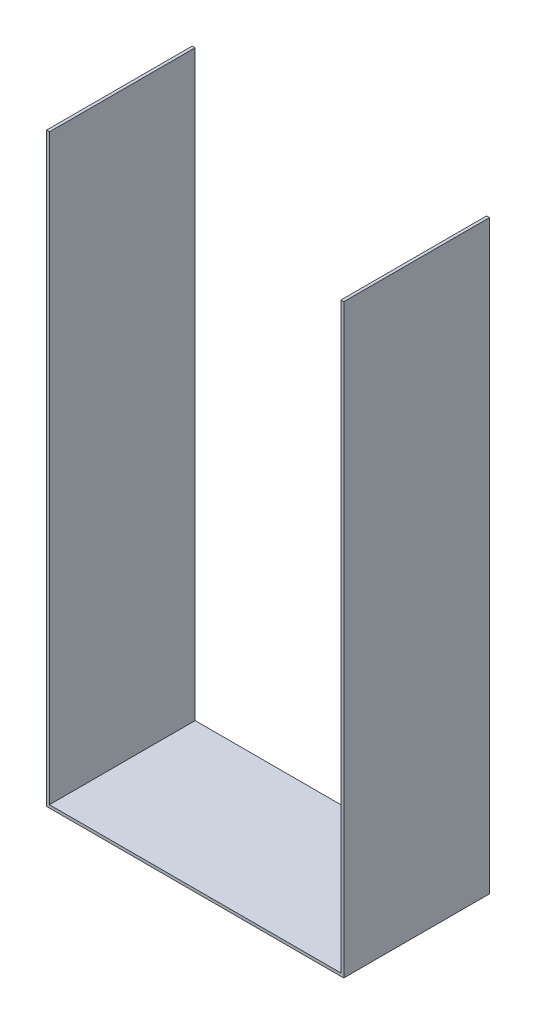
ISO-10303-21;
HEADER;
FILE_DESCRIPTION(('STEP AP214'),'2;1');
FILE_NAME('part.step','',(''),(''),'','','');
FILE_SCHEMA(('AUTOMOTIVE_DESIGN { 1 0 10303 214 1 1 1 1 }'));
ENDSEC;
DATA;
#1=APPLICATION_CONTEXT('core data for automotive mechanical design processes');
#2=APPLICATION_PROTOCOL_DEFINITION('international standard','automotive_design',2000,#1);
#3=PRODUCT_CONTEXT('',#1,'mechanical');
#4=PRODUCT('Part','Part','',(#3));
#5=PRODUCT_RELATED_PRODUCT_CATEGORY('part','',(#4));
#6=PRODUCT_DEFINITION_FORMATION('','',#4);
#7=PRODUCT_DEFINITION_CONTEXT('part definition',#1,'design');
#8=PRODUCT_DEFINITION('design','',#6,#7);
#9=PRODUCT_DEFINITION_SHAPE('','',#8);
#10=(LENGTH_UNIT() NAMED_UNIT(*) SI_UNIT(.MILLI.,.METRE.));
#11=(NAMED_UNIT(*) PLANE_ANGLE_UNIT() SI_UNIT($,.RADIAN.));
#12=(NAMED_UNIT(*) SI_UNIT($,.STERADIAN.) SOLID_ANGLE_UNIT());
#13=UNCERTAINTY_MEASURE_WITH_UNIT(LENGTH_MEASURE(1.E-05),#10,'distance_accuracy_value','');
#14=(GEOMETRIC_REPRESENTATION_CONTEXT(3) GLOBAL_UNCERTAINTY_ASSIGNED_CONTEXT((#13)) GLOBAL_UNIT_ASSIGNED_CONTEXT((#10,
#11,#12)) REPRESENTATION_CONTEXT('',''));
#15=CARTESIAN_POINT('',(0.,0.,0.));
#16=DIRECTION('',(0.,0.,1.));
#17=DIRECTION('',(1.,0.,0.));
#18=AXIS2_PLACEMENT_3D('',#15,#16,#17);
#19=CARTESIAN_POINT('',(-200.,0.,-10000.));
#20=DIRECTION('',(0.,1.,0.));
#21=DIRECTION('',(0.,0.,1.));
#22=AXIS2_PLACEMENT_3D('',#19,#20,#21);
#23=PLANE('',#22);
#24=DIRECTION('',(-1.,0.,0.));
#25=VECTOR('',#24,1.);
#26=CARTESIAN_POINT('',(-200.,0.,0.));
#27=LINE('',#26,#25);
#28=CARTESIAN_POINT('',(0.,0.,0.));
#29=VERTEX_POINT('',#28);
#30=CARTESIAN_POINT('',(-200.,0.,0.));
#31=VERTEX_POINT('',#30);
#32=EDGE_CURVE('E146',#29,#31,#27,.T.);
#33=ORIENTED_EDGE('',*,*,#32,.F.);
#34=DIRECTION('',(0.,0.,1.));
#35=VECTOR('',#34,1.);
#36=CARTESIAN_POINT('',(0.,0.,-10000.));
#37=LINE('',#36,#35);
#38=CARTESIAN_POINT('',(0.,0.,-10000.));
#39=VERTEX_POINT('',#38);
#40=EDGE_CURVE('E11',#39,#29,#37,.T.);
#41=ORIENTED_EDGE('',*,*,#40,.F.);
#42=DIRECTION('',(-1.,0.,0.));
#43=VECTOR('',#42,1.);
#44=CARTESIAN_POINT('',(-200.,0.,-10000.));
#45=LINE('',#44,#43);
#46=CARTESIAN_POINT('',(-200.,0.,-10000.));
#47=VERTEX_POINT('',#46);
#48=EDGE_CURVE('E174',#39,#47,#45,.T.);
#49=ORIENTED_EDGE('',*,*,#48,.T.);
#50=DIRECTION('',(0.,0.,1.));
#51=VECTOR('',#50,1.);
#52=CARTESIAN_POINT('',(-200.,0.,-10000.));
#53=LINE('',#52,#51);
#54=EDGE_CURVE('E46',#47,#31,#53,.T.);
#55=ORIENTED_EDGE('',*,*,#54,.T.);
#56=EDGE_LOOP('',(#33,#41,#49,#55));
#57=FACE_BOUND('',#56,.T.);
#58=ADVANCED_FACE('F43',(#57),#23,.T.);
#59=CARTESIAN_POINT('',(0.,0.,-10000.));
#60=DIRECTION('',(1.,0.,0.));
#61=DIRECTION('',(0.,1.,0.));
#62=AXIS2_PLACEMENT_3D('',#59,#60,#61);
#63=PLANE('',#62);
#64=DIRECTION('',(0.,1.,0.));
#65=VECTOR('',#64,1.);
#66=CARTESIAN_POINT('',(0.,0.,0.));
#67=LINE('',#66,#65);
#68=CARTESIAN_POINT('',(4.89858719658941E-12,-40000.,0.));
#69=VERTEX_POINT('',#68);
#70=EDGE_CURVE('E171',#69,#29,#67,.T.);
#71=ORIENTED_EDGE('',*,*,#70,.F.);
#72=DIRECTION('',(0.,0.,1.));
#73=VECTOR('',#72,1.);
#74=CARTESIAN_POINT('',(4.89858719658941E-12,-40000.,-10000.));
#75=LINE('',#74,#73);
#76=CARTESIAN_POINT('',(4.89858719658941E-12,-40000.,-10000.));
#77=VERTEX_POINT('',#76);
#78=EDGE_CURVE('E53',#77,#69,#75,.T.);
#79=ORIENTED_EDGE('',*,*,#78,.F.);
#80=DIRECTION('',(0.,1.,0.));
#81=VECTOR('',#80,1.);
#82=CARTESIAN_POINT('',(0.,0.,-10000.));
#83=LINE('',#82,#81);
#84=EDGE_CURVE('E132',#77,#39,#83,.T.);
#85=ORIENTED_EDGE('',*,*,#84,.T.);
#86=ORIENTED_EDGE('',*,*,#40,.T.);
#87=EDGE_LOOP('',(#71,#79,#85,#86));
#88=FACE_BOUND('',#87,.T.);
#89=ADVANCED_FACE('F192',(#88),#63,.T.);
#90=CARTESIAN_POINT('',(4.89858719658941E-12,-40000.,-10000.));
#91=DIRECTION('',(0.,1.,0.));
#92=DIRECTION('',(0.,0.,1.));
#93=AXIS2_PLACEMENT_3D('',#90,#91,#92);
#94=PLANE('',#93);
#95=DIRECTION('',(-1.,0.,0.));
#96=VECTOR('',#95,1.);
#97=CARTESIAN_POINT('',(4.89858719658941E-12,-40000.,0.));
#98=LINE('',#97,#96);
#99=CARTESIAN_POINT('',(20000.,-40000.,0.));
#100=VERTEX_POINT('',#99);
#101=EDGE_CURVE('E118',#100,#69,#98,.T.);
#102=ORIENTED_EDGE('',*,*,#101,.F.);
#103=DIRECTION('',(0.,0.,1.));
#104=VECTOR('',#103,1.);
#105=CARTESIAN_POINT('',(20000.,-40000.,-10000.));
#106=LINE('',#105,#104);
#107=CARTESIAN_POINT('',(20000.,-40000.,-10000.));
#108=VERTEX_POINT('',#107);
#109=EDGE_CURVE('E113',#108,#100,#106,.T.);
#110=ORIENTED_EDGE('',*,*,#109,.F.);
#111=DIRECTION('',(-1.,0.,0.));
#112=VECTOR('',#111,1.);
#113=CARTESIAN_POINT('',(4.89858719658941E-12,-40000.,-10000.));
#114=LINE('',#113,#112);
#115=EDGE_CURVE('E116',#108,#77,#114,.T.);
#116=ORIENTED_EDGE('',*,*,#115,.T.);
#117=ORIENTED_EDGE('',*,*,#78,.T.);
#118=EDGE_LOOP('',(#102,#110,#116,#117));
#119=FACE_BOUND('',#118,.T.);
#120=ADVANCED_FACE('F115',(#119),#94,.T.);
#121=CARTESIAN_POINT('',(20000.,-40000.,-10000.));
#122=DIRECTION('',(-1.,0.,0.));
#123=DIRECTION('',(0.,0.,1.));
#124=AXIS2_PLACEMENT_3D('',#121,#122,#123);
#125=PLANE('',#124);
#126=DIRECTION('',(0.,-1.,0.));
#127=VECTOR('',#126,1.);
#128=CARTESIAN_POINT('',(20000.,-40000.,0.));
#129=LINE('',#128,#127);
#130=CARTESIAN_POINT('',(20000.,0.,0.));
#131=VERTEX_POINT('',#130);
#132=EDGE_CURVE('E166',#131,#100,#129,.T.);
#133=ORIENTED_EDGE('',*,*,#132,.F.);
#134=DIRECTION('',(0.,0.,1.));
#135=VECTOR('',#134,1.);
#136=CARTESIAN_POINT('',(20000.,0.,-10000.));
#137=LINE('',#136,#135);
#138=CARTESIAN_POINT('',(20000.,0.,-10000.));
#139=VERTEX_POINT('',#138);
#140=EDGE_CURVE('E124',#139,#131,#137,.T.);
#141=ORIENTED_EDGE('',*,*,#140,.F.);
#142=DIRECTION('',(0.,-1.,0.));
#143=VECTOR('',#142,1.);
#144=CARTESIAN_POINT('',(20000.,-40000.,-10000.));
#145=LINE('',#144,#143);
#146=EDGE_CURVE('E130',#139,#108,#145,.T.);
#147=ORIENTED_EDGE('',*,*,#146,.T.);
#148=ORIENTED_EDGE('',*,*,#109,.T.);
#149=EDGE_LOOP('',(#133,#141,#147,#148));
#150=FACE_BOUND('',#149,.T.);
#151=ADVANCED_FACE('F135',(#150),#125,.T.);
#152=CARTESIAN_POINT('',(20000.,0.,-10000.));
#153=DIRECTION('',(0.,1.,0.));
#154=DIRECTION('',(0.,0.,1.));
#155=AXIS2_PLACEMENT_3D('',#152,#153,#154);
#156=PLANE('',#155);
#157=DIRECTION('',(-1.,0.,0.));
#158=VECTOR('',#157,1.);
#159=CARTESIAN_POINT('',(20000.,0.,0.));
#160=LINE('',#159,#158);
#161=CARTESIAN_POINT('',(20200.,0.,0.));
#162=VERTEX_POINT('',#161);
#163=EDGE_CURVE('E162',#162,#131,#160,.T.);
#164=ORIENTED_EDGE('',*,*,#163,.F.);
#165=DIRECTION('',(0.,0.,1.));
#166=VECTOR('',#165,1.);
#167=CARTESIAN_POINT('',(20200.,0.,-10000.));
#168=LINE('',#167,#166);
#169=CARTESIAN_POINT('',(20200.,0.,-10000.));
#170=VERTEX_POINT('',#169);
#171=EDGE_CURVE('E180',#170,#162,#168,.T.);
#172=ORIENTED_EDGE('',*,*,#171,.F.);
#173=DIRECTION('',(-1.,0.,0.));
#174=VECTOR('',#173,1.);
#175=CARTESIAN_POINT('',(20000.,0.,-10000.));
#176=LINE('',#175,#174);
#177=EDGE_CURVE('E137',#170,#139,#176,.T.);
#178=ORIENTED_EDGE('',*,*,#177,.T.);
#179=ORIENTED_EDGE('',*,*,#140,.T.);
#180=EDGE_LOOP('',(#164,#172,#178,#179));
#181=FACE_BOUND('',#180,.T.);
#182=ADVANCED_FACE('F205',(#181),#156,.T.);
#183=CARTESIAN_POINT('',(20200.,-40200.,-10000.));
#184=DIRECTION('',(1.,0.,0.));
#185=DIRECTION('',(0.,0.,-1.));
#186=AXIS2_PLACEMENT_3D('',#183,#184,#185);
#187=PLANE('',#186);
#188=DIRECTION('',(0.,1.,0.));
#189=VECTOR('',#188,1.);
#190=CARTESIAN_POINT('',(20200.,-40200.,0.));
#191=LINE('',#190,#189);
#192=CARTESIAN_POINT('',(20200.,-40200.,0.));
#193=VERTEX_POINT('',#192);
#194=EDGE_CURVE('E158',#193,#162,#191,.T.);
#195=ORIENTED_EDGE('',*,*,#194,.F.);
#196=DIRECTION('',(0.,0.,1.));
#197=VECTOR('',#196,1.);
#198=CARTESIAN_POINT('',(20200.,-40200.,-10000.));
#199=LINE('',#198,#197);
#200=CARTESIAN_POINT('',(20200.,-40200.,-10000.));
#201=VERTEX_POINT('',#200);
#202=EDGE_CURVE('E183',#201,#193,#199,.T.);
#203=ORIENTED_EDGE('',*,*,#202,.F.);
#204=DIRECTION('',(0.,1.,0.));
#205=VECTOR('',#204,1.);
#206=CARTESIAN_POINT('',(20200.,-40200.,-10000.));
#207=LINE('',#206,#205);
#208=EDGE_CURVE('E140',#201,#170,#207,.T.);
#209=ORIENTED_EDGE('',*,*,#208,.T.);
#210=ORIENTED_EDGE('',*,*,#171,.T.);
#211=EDGE_LOOP('',(#195,#203,#209,#210));
#212=FACE_BOUND('',#211,.T.);
#213=ADVANCED_FACE('F208',(#212),#187,.T.);
#214=CARTESIAN_POINT('',(-199.999999999994,-40200.,-10000.));
#215=DIRECTION('',(0.,-1.,0.));
#216=DIRECTION('',(0.,0.,-1.));
#217=AXIS2_PLACEMENT_3D('',#214,#215,#216);
#218=PLANE('',#217);
#219=DIRECTION('',(1.,0.,0.));
#220=VECTOR('',#219,1.);
#221=CARTESIAN_POINT('',(-199.999999999994,-40200.,0.));
#222=LINE('',#221,#220);
#223=CARTESIAN_POINT('',(-199.999999999994,-40200.,0.));
#224=VERTEX_POINT('',#223);
#225=EDGE_CURVE('E154',#224,#193,#222,.T.);
#226=ORIENTED_EDGE('',*,*,#225,.F.);
#227=DIRECTION('',(0.,0.,1.));
#228=VECTOR('',#227,1.);
#229=CARTESIAN_POINT('',(-199.999999999994,-40200.,-10000.));
#230=LINE('',#229,#228);
#231=CARTESIAN_POINT('',(-199.999999999994,-40200.,-10000.));
#232=VERTEX_POINT('',#231);
#233=EDGE_CURVE('E185',#232,#224,#230,.T.);
#234=ORIENTED_EDGE('',*,*,#233,.F.);
#235=DIRECTION('',(1.,0.,0.));
#236=VECTOR('',#235,1.);
#237=CARTESIAN_POINT('',(-199.999999999994,-40200.,-10000.));
#238=LINE('',#237,#236);
#239=EDGE_CURVE('E303',#232,#201,#238,.T.);
#240=ORIENTED_EDGE('',*,*,#239,.T.);
#241=ORIENTED_EDGE('',*,*,#202,.T.);
#242=EDGE_LOOP('',(#226,#234,#240,#241));
#243=FACE_BOUND('',#242,.T.);
#244=ADVANCED_FACE('F212',(#243),#218,.T.);
#245=CARTESIAN_POINT('',(-200.,0.,-10000.));
#246=DIRECTION('',(-1.,0.,0.));
#247=DIRECTION('',(0.,-1.,0.));
#248=AXIS2_PLACEMENT_3D('',#245,#246,#247);
#249=PLANE('',#248);
#250=DIRECTION('',(0.,-1.,0.));
#251=VECTOR('',#250,1.);
#252=CARTESIAN_POINT('',(-200.,0.,0.));
#253=LINE('',#252,#251);
#254=EDGE_CURVE('E150',#31,#224,#253,.T.);
#255=ORIENTED_EDGE('',*,*,#254,.F.);
#256=ORIENTED_EDGE('',*,*,#54,.F.);
#257=DIRECTION('',(0.,-1.,0.));
#258=VECTOR('',#257,1.);
#259=CARTESIAN_POINT('',(-200.,0.,-10000.));
#260=LINE('',#259,#258);
#261=EDGE_CURVE('E306',#47,#232,#260,.T.);
#262=ORIENTED_EDGE('',*,*,#261,.T.);
#263=ORIENTED_EDGE('',*,*,#233,.T.);
#264=EDGE_LOOP('',(#255,#256,#262,#263));
#265=FACE_BOUND('',#264,.T.);
#266=ADVANCED_FACE('F189',(#265),#249,.T.);
#267=CARTESIAN_POINT('',(0.,0.,-10000.));
#268=DIRECTION('',(0.,0.,-1.));
#269=DIRECTION('',(-1.,0.,0.));
#270=AXIS2_PLACEMENT_3D('',#267,#268,#269);
#271=PLANE('',#270);
#272=ORIENTED_EDGE('',*,*,#48,.F.);
#273=ORIENTED_EDGE('',*,*,#84,.F.);
#274=ORIENTED_EDGE('',*,*,#115,.F.);
#275=ORIENTED_EDGE('',*,*,#146,.F.);
#276=ORIENTED_EDGE('',*,*,#177,.F.);
#277=ORIENTED_EDGE('',*,*,#208,.F.);
#278=ORIENTED_EDGE('',*,*,#239,.F.);
#279=ORIENTED_EDGE('',*,*,#261,.F.);
#280=EDGE_LOOP('',(#272,#273,#274,#275,#276,#277,#278,#279));
#281=FACE_BOUND('',#280,.T.);
#282=ADVANCED_FACE('F128',(#281),#271,.T.);
#283=CARTESIAN_POINT('',(0.,0.,0.));
#284=DIRECTION('',(0.,0.,-1.));
#285=DIRECTION('',(-1.,0.,0.));
#286=AXIS2_PLACEMENT_3D('',#283,#284,#285);
#287=PLANE('',#286);
#288=ORIENTED_EDGE('',*,*,#32,.T.);
#289=ORIENTED_EDGE('',*,*,#254,.T.);
#290=ORIENTED_EDGE('',*,*,#225,.T.);
#291=ORIENTED_EDGE('',*,*,#194,.T.);
#292=ORIENTED_EDGE('',*,*,#163,.T.);
#293=ORIENTED_EDGE('',*,*,#132,.T.);
#294=ORIENTED_EDGE('',*,*,#101,.T.);
#295=ORIENTED_EDGE('',*,*,#70,.T.);
#296=EDGE_LOOP('',(#288,#289,#290,#291,#292,#293,#294,#295));
#297=FACE_BOUND('',#296,.T.);
#298=ADVANCED_FACE('F191',(#297),#287,.F.);
#299=CLOSED_SHELL('',(#58,#89,#120,#151,#182,#213,#244,#266,#282,#298));
#300=MANIFOLD_SOLID_BREP('B2',#299);
#301=ADVANCED_BREP_SHAPE_REPRESENTATION('',(#18,#300),#14);
#302=SHAPE_DEFINITION_REPRESENTATION(#9,#301);
ENDSEC;
END-ISO-10303-21;
